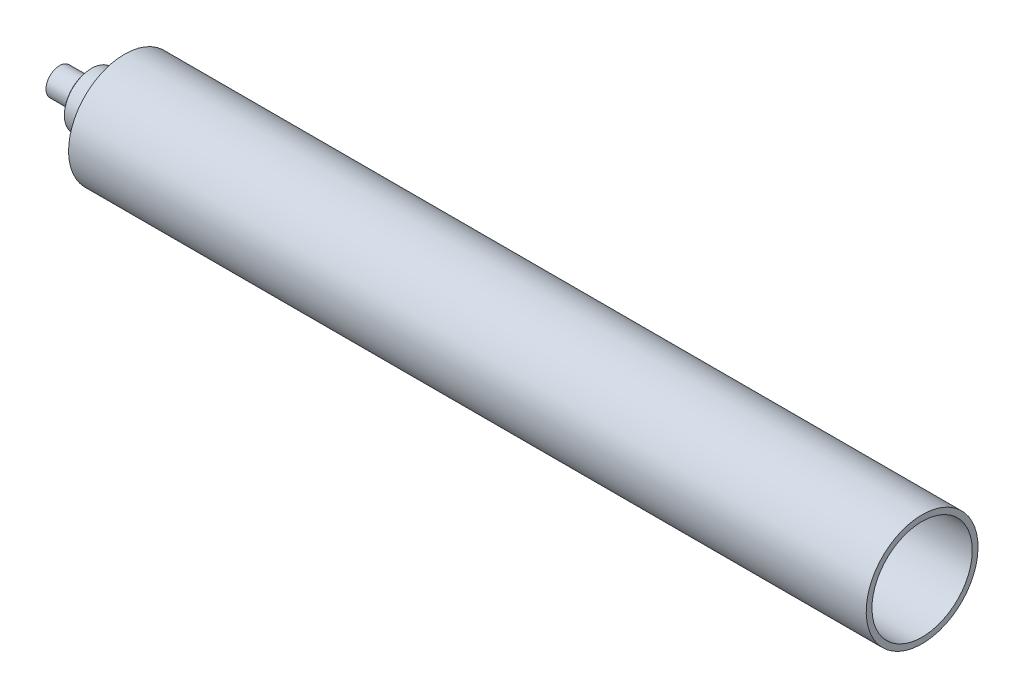
ISO-10303-21;
HEADER;
FILE_DESCRIPTION(('STEP AP214'),'2;1');
FILE_NAME('part.step','',(''),(''),'','','');
FILE_SCHEMA(('AUTOMOTIVE_DESIGN { 1 0 10303 214 1 1 1 1 }'));
ENDSEC;
DATA;
#1=APPLICATION_CONTEXT('core data for automotive mechanical design processes');
#2=APPLICATION_PROTOCOL_DEFINITION('international standard','automotive_design',2000,#1);
#3=PRODUCT_CONTEXT('',#1,'mechanical');
#4=PRODUCT('Part','Part','',(#3));
#5=PRODUCT_RELATED_PRODUCT_CATEGORY('part','',(#4));
#6=PRODUCT_DEFINITION_FORMATION('','',#4);
#7=PRODUCT_DEFINITION_CONTEXT('part definition',#1,'design');
#8=PRODUCT_DEFINITION('design','',#6,#7);
#9=PRODUCT_DEFINITION_SHAPE('','',#8);
#10=(LENGTH_UNIT() NAMED_UNIT(*) SI_UNIT(.MILLI.,.METRE.));
#11=(NAMED_UNIT(*) PLANE_ANGLE_UNIT() SI_UNIT($,.RADIAN.));
#12=(NAMED_UNIT(*) SI_UNIT($,.STERADIAN.) SOLID_ANGLE_UNIT());
#13=UNCERTAINTY_MEASURE_WITH_UNIT(LENGTH_MEASURE(1.E-05),#10,'distance_accuracy_value','');
#14=(GEOMETRIC_REPRESENTATION_CONTEXT(3) GLOBAL_UNCERTAINTY_ASSIGNED_CONTEXT((#13)) GLOBAL_UNIT_ASSIGNED_CONTEXT((#10,
#11,#12)) REPRESENTATION_CONTEXT('',''));
#15=CARTESIAN_POINT('',(0.,0.,0.));
#16=DIRECTION('',(0.,0.,1.));
#17=DIRECTION('',(1.,0.,0.));
#18=AXIS2_PLACEMENT_3D('',#15,#16,#17);
#19=CARTESIAN_POINT('',(62.23,0.,0.));
#20=DIRECTION('',(1.,0.,0.));
#21=DIRECTION('',(0.,1.,0.));
#22=AXIS2_PLACEMENT_3D('',#19,#20,#21);
#23=PLANE('',#22);
#24=CARTESIAN_POINT('',(62.23,0.,0.));
#25=DIRECTION('',(1.,0.,0.));
#26=DIRECTION('',(0.,1.,0.));
#27=AXIS2_PLACEMENT_3D('',#24,#25,#26);
#28=CIRCLE('',#27,44.1325);
#29=CARTESIAN_POINT('',(62.23,44.1325,0.));
#30=VERTEX_POINT('',#29);
#31=EDGE_CURVE('E11',#30,#30,#28,.T.);
#32=ORIENTED_EDGE('',*,*,#31,.T.);
#33=EDGE_LOOP('',(#32));
#34=FACE_BOUND('',#33,.T.);
#35=ADVANCED_FACE('F38',(#34),#23,.T.);
#36=CARTESIAN_POINT('',(62.23,0.,0.));
#37=DIRECTION('',(1.,0.,0.));
#38=DIRECTION('',(0.,1.,0.));
#39=AXIS2_PLACEMENT_3D('',#36,#37,#38);
#40=CYLINDRICAL_SURFACE('',#39,44.1325);
#41=CARTESIAN_POINT('',(759.206,0.,0.));
#42=DIRECTION('',(1.,0.,0.));
#43=DIRECTION('',(0.,1.,0.));
#44=AXIS2_PLACEMENT_3D('',#41,#42,#43);
#45=CIRCLE('',#44,44.1325);
#46=CARTESIAN_POINT('',(759.206,44.1325,0.));
#47=VERTEX_POINT('',#46);
#48=EDGE_CURVE('E44',#47,#47,#45,.T.);
#49=ORIENTED_EDGE('',*,*,#48,.T.);
#50=EDGE_LOOP('',(#49));
#51=FACE_BOUND('',#50,.T.);
#52=ORIENTED_EDGE('',*,*,#31,.F.);
#53=EDGE_LOOP('',(#52));
#54=FACE_BOUND('',#53,.T.);
#55=ADVANCED_FACE('F60',(#51,#54),#40,.F.);
#56=CARTESIAN_POINT('',(759.206,49.2125,0.));
#57=DIRECTION('',(1.,0.,0.));
#58=DIRECTION('',(0.,1.,0.));
#59=AXIS2_PLACEMENT_3D('',#56,#57,#58);
#60=PLANE('',#59);
#61=CARTESIAN_POINT('',(759.206,0.,0.));
#62=DIRECTION('',(1.,0.,0.));
#63=DIRECTION('',(0.,1.,0.));
#64=AXIS2_PLACEMENT_3D('',#61,#62,#63);
#65=CIRCLE('',#64,49.2125);
#66=CARTESIAN_POINT('',(759.206,49.2125,0.));
#67=VERTEX_POINT('',#66);
#68=EDGE_CURVE('E159',#67,#67,#65,.T.);
#69=ORIENTED_EDGE('',*,*,#68,.T.);
#70=EDGE_LOOP('',(#69));
#71=FACE_BOUND('',#70,.T.);
#72=ORIENTED_EDGE('',*,*,#48,.F.);
#73=EDGE_LOOP('',(#72));
#74=FACE_BOUND('',#73,.T.);
#75=ADVANCED_FACE('F65',(#71,#74),#60,.T.);
#76=CARTESIAN_POINT('',(62.23,0.,0.));
#77=DIRECTION('',(1.,0.,0.));
#78=DIRECTION('',(0.,1.,0.));
#79=AXIS2_PLACEMENT_3D('',#76,#77,#78);
#80=CYLINDRICAL_SURFACE('',#79,49.2125);
#81=CARTESIAN_POINT('',(57.15,0.,0.));
#82=DIRECTION('',(1.,0.,0.));
#83=DIRECTION('',(0.,1.,0.));
#84=AXIS2_PLACEMENT_3D('',#81,#82,#83);
#85=CIRCLE('',#84,49.2125);
#86=CARTESIAN_POINT('',(57.15,49.2125,0.));
#87=VERTEX_POINT('',#86);
#88=EDGE_CURVE('E156',#87,#87,#85,.T.);
#89=ORIENTED_EDGE('',*,*,#88,.T.);
#90=EDGE_LOOP('',(#89));
#91=FACE_BOUND('',#90,.T.);
#92=ORIENTED_EDGE('',*,*,#68,.F.);
#93=EDGE_LOOP('',(#92));
#94=FACE_BOUND('',#93,.T.);
#95=ADVANCED_FACE('F72',(#91,#94),#80,.T.);
#96=CARTESIAN_POINT('',(57.15,23.876,0.));
#97=DIRECTION('',(-1.,0.,0.));
#98=DIRECTION('',(0.,-1.,0.));
#99=AXIS2_PLACEMENT_3D('',#96,#97,#98);
#100=PLANE('',#99);
#101=CARTESIAN_POINT('',(57.15,0.,0.));
#102=DIRECTION('',(1.,0.,0.));
#103=DIRECTION('',(0.,1.,0.));
#104=AXIS2_PLACEMENT_3D('',#101,#102,#103);
#105=CIRCLE('',#104,23.876);
#106=CARTESIAN_POINT('',(57.15,23.876,0.));
#107=VERTEX_POINT('',#106);
#108=EDGE_CURVE('E153',#107,#107,#105,.T.);
#109=ORIENTED_EDGE('',*,*,#108,.T.);
#110=EDGE_LOOP('',(#109));
#111=FACE_BOUND('',#110,.T.);
#112=ORIENTED_EDGE('',*,*,#88,.F.);
#113=EDGE_LOOP('',(#112));
#114=FACE_BOUND('',#113,.T.);
#115=ADVANCED_FACE('F79',(#111,#114),#100,.T.);
#116=CARTESIAN_POINT('',(62.23,0.,0.));
#117=DIRECTION('',(1.,0.,0.));
#118=DIRECTION('',(0.,1.,0.));
#119=AXIS2_PLACEMENT_3D('',#116,#117,#118);
#120=CYLINDRICAL_SURFACE('',#119,23.876);
#121=CARTESIAN_POINT('',(28.1044065311285,0.,0.));
#122=DIRECTION('',(1.,0.,0.));
#123=DIRECTION('',(0.,1.,0.));
#124=AXIS2_PLACEMENT_3D('',#121,#122,#123);
#125=CIRCLE('',#124,23.876);
#126=CARTESIAN_POINT('',(28.1044065311285,23.876,0.));
#127=VERTEX_POINT('',#126);
#128=EDGE_CURVE('E150',#127,#127,#125,.T.);
#129=ORIENTED_EDGE('',*,*,#128,.T.);
#130=EDGE_LOOP('',(#129));
#131=FACE_BOUND('',#130,.T.);
#132=ORIENTED_EDGE('',*,*,#108,.F.);
#133=EDGE_LOOP('',(#132));
#134=FACE_BOUND('',#133,.T.);
#135=ADVANCED_FACE('F83',(#131,#134),#120,.T.);
#136=CARTESIAN_POINT('',(28.1044065311285,0.,0.));
#137=DIRECTION('',(1.,0.,0.));
#138=DIRECTION('',(0.,1.,0.));
#139=AXIS2_PLACEMENT_3D('',#136,#137,#138);
#140=CONICAL_SURFACE('',#139,23.876,0.867608495422664);
#141=CARTESIAN_POINT('',(27.305,0.,0.));
#142=DIRECTION('',(1.,0.,0.));
#143=DIRECTION('',(0.,1.,0.));
#144=AXIS2_PLACEMENT_3D('',#141,#142,#143);
#145=CIRCLE('',#144,22.9330284091227);
#146=CARTESIAN_POINT('',(27.305,22.9330284091227,0.));
#147=VERTEX_POINT('',#146);
#148=EDGE_CURVE('E147',#147,#147,#145,.T.);
#149=ORIENTED_EDGE('',*,*,#148,.T.);
#150=EDGE_LOOP('',(#149));
#151=FACE_BOUND('',#150,.T.);
#152=ORIENTED_EDGE('',*,*,#128,.F.);
#153=EDGE_LOOP('',(#152));
#154=FACE_BOUND('',#153,.T.);
#155=ADVANCED_FACE('F87',(#151,#154),#140,.T.);
#156=CARTESIAN_POINT('',(27.305,14.478,0.));
#157=DIRECTION('',(-1.,0.,0.));
#158=DIRECTION('',(0.,-1.,0.));
#159=AXIS2_PLACEMENT_3D('',#156,#157,#158);
#160=PLANE('',#159);
#161=CARTESIAN_POINT('',(27.305,0.,0.));
#162=DIRECTION('',(1.,0.,0.));
#163=DIRECTION('',(0.,1.,0.));
#164=AXIS2_PLACEMENT_3D('',#161,#162,#163);
#165=CIRCLE('',#164,14.478);
#166=CARTESIAN_POINT('',(27.305,14.478,0.));
#167=VERTEX_POINT('',#166);
#168=EDGE_CURVE('E144',#167,#167,#165,.T.);
#169=ORIENTED_EDGE('',*,*,#168,.T.);
#170=EDGE_LOOP('',(#169));
#171=FACE_BOUND('',#170,.T.);
#172=ORIENTED_EDGE('',*,*,#148,.F.);
#173=EDGE_LOOP('',(#172));
#174=FACE_BOUND('',#173,.T.);
#175=ADVANCED_FACE('F91',(#171,#174),#160,.T.);
#176=CARTESIAN_POINT('',(24.765,0.,0.));
#177=DIRECTION('',(1.,0.,0.));
#178=DIRECTION('',(0.,1.,0.));
#179=AXIS2_PLACEMENT_3D('',#176,#177,#178);
#180=TOROIDAL_SURFACE('',#179,14.478,2.54);
#181=CARTESIAN_POINT('',(24.765,0.,0.));
#182=DIRECTION('',(1.,0.,0.));
#183=DIRECTION('',(0.,1.,0.));
#184=AXIS2_PLACEMENT_3D('',#181,#182,#183);
#185=CIRCLE('',#184,11.938);
#186=CARTESIAN_POINT('',(24.765,11.938,0.));
#187=VERTEX_POINT('',#186);
#188=EDGE_CURVE('E141',#187,#187,#185,.T.);
#189=ORIENTED_EDGE('',*,*,#188,.T.);
#190=EDGE_LOOP('',(#189));
#191=FACE_BOUND('',#190,.T.);
#192=ORIENTED_EDGE('',*,*,#168,.F.);
#193=EDGE_LOOP('',(#192));
#194=FACE_BOUND('',#193,.T.);
#195=ADVANCED_FACE('F95',(#191,#194),#180,.F.);
#196=CARTESIAN_POINT('',(62.23,0.,0.));
#197=DIRECTION('',(1.,0.,0.));
#198=DIRECTION('',(0.,1.,0.));
#199=AXIS2_PLACEMENT_3D('',#196,#197,#198);
#200=CYLINDRICAL_SURFACE('',#199,11.938);
#201=CARTESIAN_POINT('',(0.,0.,0.));
#202=DIRECTION('',(1.,0.,0.));
#203=DIRECTION('',(0.,1.,0.));
#204=AXIS2_PLACEMENT_3D('',#201,#202,#203);
#205=CIRCLE('',#204,11.938);
#206=CARTESIAN_POINT('',(0.,11.938,0.));
#207=VERTEX_POINT('',#206);
#208=EDGE_CURVE('E138',#207,#207,#205,.T.);
#209=ORIENTED_EDGE('',*,*,#208,.T.);
#210=EDGE_LOOP('',(#209));
#211=FACE_BOUND('',#210,.T.);
#212=ORIENTED_EDGE('',*,*,#188,.F.);
#213=EDGE_LOOP('',(#212));
#214=FACE_BOUND('',#213,.T.);
#215=ADVANCED_FACE('F99',(#211,#214),#200,.T.);
#216=CARTESIAN_POINT('',(0.,0.,0.));
#217=DIRECTION('',(-1.,0.,0.));
#218=DIRECTION('',(0.,-1.,0.));
#219=AXIS2_PLACEMENT_3D('',#216,#217,#218);
#220=PLANE('',#219);
#221=CARTESIAN_POINT('',(0.,0.,0.));
#222=DIRECTION('',(1.,0.,0.));
#223=DIRECTION('',(0.,0.,-1.));
#224=AXIS2_PLACEMENT_3D('',#221,#222,#223);
#225=CIRCLE('',#224,8.35025);
#226=CARTESIAN_POINT('',(0.,0.,-8.35025));
#227=VERTEX_POINT('',#226);
#228=EDGE_CURVE('E130',#227,#227,#225,.T.);
#229=ORIENTED_EDGE('',*,*,#228,.T.);
#230=EDGE_LOOP('',(#229));
#231=FACE_BOUND('',#230,.T.);
#232=ORIENTED_EDGE('',*,*,#208,.F.);
#233=EDGE_LOOP('',(#232));
#234=FACE_BOUND('',#233,.T.);
#235=ADVANCED_FACE('F103',(#231,#234),#220,.T.);
#236=CARTESIAN_POINT('',(1.905,0.,0.));
#237=DIRECTION('',(-1.,0.,0.));
#238=DIRECTION('',(0.,0.,1.));
#239=AXIS2_PLACEMENT_3D('',#236,#237,#238);
#240=CONICAL_SURFACE('',#239,6.556375,0.755364278732698);
#241=ORIENTED_EDGE('',*,*,#228,.F.);
#242=EDGE_LOOP('',(#241));
#243=FACE_BOUND('',#242,.T.);
#244=CARTESIAN_POINT('',(1.905,0.,0.));
#245=DIRECTION('',(1.,0.,0.));
#246=DIRECTION('',(0.,0.,-1.));
#247=AXIS2_PLACEMENT_3D('',#244,#245,#246);
#248=CIRCLE('',#247,6.556375);
#249=CARTESIAN_POINT('',(1.905,0.,-6.556375));
#250=VERTEX_POINT('',#249);
#251=EDGE_CURVE('E127',#250,#250,#248,.T.);
#252=ORIENTED_EDGE('',*,*,#251,.T.);
#253=EDGE_LOOP('',(#252));
#254=FACE_BOUND('',#253,.T.);
#255=ADVANCED_FACE('F107',(#243,#254),#240,.F.);
#256=CARTESIAN_POINT('',(1.905,0.,-6.556375));
#257=DIRECTION('',(1.,0.,0.));
#258=DIRECTION('',(0.,0.,-1.));
#259=AXIS2_PLACEMENT_3D('',#256,#257,#258);
#260=PLANE('',#259);
#261=CARTESIAN_POINT('',(1.905,0.,0.));
#262=DIRECTION('',(-1.,0.,0.));
#263=DIRECTION('',(0.,0.,1.));
#264=AXIS2_PLACEMENT_3D('',#261,#262,#263);
#265=CIRCLE('',#264,4.);
#266=CARTESIAN_POINT('',(1.905,0.,4.));
#267=VERTEX_POINT('',#266);
#268=EDGE_CURVE('E126',#267,#267,#265,.T.);
#269=ORIENTED_EDGE('',*,*,#268,.F.);
#270=EDGE_LOOP('',(#269));
#271=FACE_BOUND('',#270,.T.);
#272=ORIENTED_EDGE('',*,*,#251,.F.);
#273=EDGE_LOOP('',(#272));
#274=FACE_BOUND('',#273,.T.);
#275=ADVANCED_FACE('F111',(#271,#274),#260,.F.);
#276=CARTESIAN_POINT('',(27.305,0.,0.));
#277=DIRECTION('',(-1.,0.,0.));
#278=DIRECTION('',(0.,0.,1.));
#279=AXIS2_PLACEMENT_3D('',#276,#277,#278);
#280=CYLINDRICAL_SURFACE('',#279,4.);
#281=CARTESIAN_POINT('',(27.305,0.,0.));
#282=DIRECTION('',(-1.,0.,0.));
#283=DIRECTION('',(0.,0.,1.));
#284=AXIS2_PLACEMENT_3D('',#281,#282,#283);
#285=CIRCLE('',#284,4.);
#286=CARTESIAN_POINT('',(27.305,0.,4.));
#287=VERTEX_POINT('',#286);
#288=EDGE_CURVE('E123',#287,#287,#285,.T.);
#289=ORIENTED_EDGE('',*,*,#288,.F.);
#290=EDGE_LOOP('',(#289));
#291=FACE_BOUND('',#290,.T.);
#292=ORIENTED_EDGE('',*,*,#268,.T.);
#293=EDGE_LOOP('',(#292));
#294=FACE_BOUND('',#293,.T.);
#295=ADVANCED_FACE('F55',(#291,#294),#280,.F.);
#296=CARTESIAN_POINT('',(27.305,0.,0.));
#297=DIRECTION('',(1.,0.,0.));
#298=DIRECTION('',(0.,0.,-1.));
#299=AXIS2_PLACEMENT_3D('',#296,#297,#298);
#300=PLANE('',#299);
#301=CARTESIAN_POINT('',(27.305,0.,0.));
#302=DIRECTION('',(-1.,0.,0.));
#303=DIRECTION('',(0.,0.,1.));
#304=AXIS2_PLACEMENT_3D('',#301,#302,#303);
#305=CIRCLE('',#304,6.35105942758608);
#306=CARTESIAN_POINT('',(27.305,0.,6.35105942758608));
#307=VERTEX_POINT('',#306);
#308=EDGE_CURVE('E132',#307,#307,#305,.T.);
#309=ORIENTED_EDGE('',*,*,#308,.F.);
#310=EDGE_LOOP('',(#309));
#311=FACE_BOUND('',#310,.T.);
#312=ORIENTED_EDGE('',*,*,#288,.T.);
#313=EDGE_LOOP('',(#312));
#314=FACE_BOUND('',#313,.T.);
#315=ADVANCED_FACE('F49',(#311,#314),#300,.T.);
#316=CARTESIAN_POINT('',(28.575,0.,0.));
#317=DIRECTION('',(-1.,0.,0.));
#318=DIRECTION('',(0.,0.,1.));
#319=AXIS2_PLACEMENT_3D('',#316,#317,#318);
#320=CONICAL_SURFACE('',#319,0.,1.37343284621992);
#321=ORIENTED_EDGE('',*,*,#308,.T.);
#322=EDGE_LOOP('',(#321));
#323=FACE_BOUND('',#322,.T.);
#324=CARTESIAN_POINT('',(28.575,0.,0.));
#325=VERTEX_POINT('',#324);
#326=VERTEX_LOOP('',#325);
#327=FACE_BOUND('',#326,.T.);
#328=ADVANCED_FACE('F47',(#323,#327),#320,.F.);
#329=CLOSED_SHELL('',(#35,#55,#75,#95,#115,#135,#155,#175,#195,#215,#235,#255,#275,#295,#315,#328));
#330=MANIFOLD_SOLID_BREP('B2',#329);
#331=ADVANCED_BREP_SHAPE_REPRESENTATION('',(#18,#330),#14);
#332=SHAPE_DEFINITION_REPRESENTATION(#9,#331);
ENDSEC;
END-ISO-10303-21;
